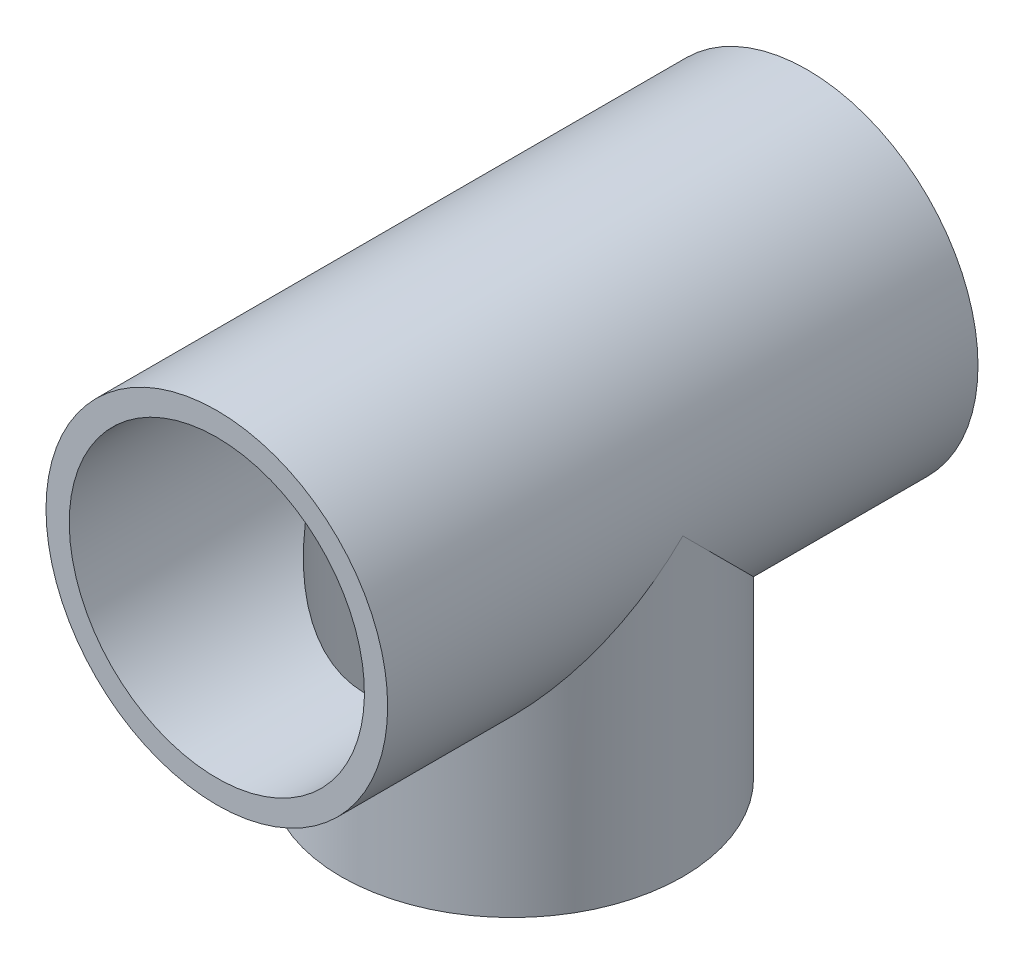
ISO-10303-21;
HEADER;
FILE_DESCRIPTION(('STEP AP214'),'2;1');
FILE_NAME('part.step','',(''),(''),'','','');
FILE_SCHEMA(('AUTOMOTIVE_DESIGN { 1 0 10303 214 1 1 1 1 }'));
ENDSEC;
DATA;
#1=APPLICATION_CONTEXT('core data for automotive mechanical design processes');
#2=APPLICATION_PROTOCOL_DEFINITION('international standard','automotive_design',2000,#1);
#3=PRODUCT_CONTEXT('',#1,'mechanical');
#4=PRODUCT('Part','Part','',(#3));
#5=PRODUCT_RELATED_PRODUCT_CATEGORY('part','',(#4));
#6=PRODUCT_DEFINITION_FORMATION('','',#4);
#7=PRODUCT_DEFINITION_CONTEXT('part definition',#1,'design');
#8=PRODUCT_DEFINITION('design','',#6,#7);
#9=PRODUCT_DEFINITION_SHAPE('','',#8);
#10=(LENGTH_UNIT() NAMED_UNIT(*) SI_UNIT(.MILLI.,.METRE.));
#11=(NAMED_UNIT(*) PLANE_ANGLE_UNIT() SI_UNIT($,.RADIAN.));
#12=(NAMED_UNIT(*) SI_UNIT($,.STERADIAN.) SOLID_ANGLE_UNIT());
#13=UNCERTAINTY_MEASURE_WITH_UNIT(LENGTH_MEASURE(1.E-05),#10,'distance_accuracy_value','');
#14=(GEOMETRIC_REPRESENTATION_CONTEXT(3) GLOBAL_UNCERTAINTY_ASSIGNED_CONTEXT((#13)) GLOBAL_UNIT_ASSIGNED_CONTEXT((#10,
#11,#12)) REPRESENTATION_CONTEXT('',''));
#15=CARTESIAN_POINT('',(0.,0.,0.));
#16=DIRECTION('',(0.,0.,1.));
#17=DIRECTION('',(1.,0.,0.));
#18=AXIS2_PLACEMENT_3D('',#15,#16,#17);
#19=CARTESIAN_POINT('',(0.,0.,12.7));
#20=DIRECTION('',(0.,0.,-1.));
#21=DIRECTION('',(0.,1.,0.));
#22=AXIS2_PLACEMENT_3D('',#19,#20,#21);
#23=CYLINDRICAL_SURFACE('',#22,6.35);
#24=CARTESIAN_POINT('',(0.,0.,12.7));
#25=DIRECTION('',(0.,0.,-1.));
#26=DIRECTION('',(0.,1.,0.));
#27=AXIS2_PLACEMENT_3D('',#24,#25,#26);
#28=CIRCLE('',#27,6.35);
#29=CARTESIAN_POINT('',(0.,6.35,12.7));
#30=VERTEX_POINT('',#29);
#31=EDGE_CURVE('E90',#30,#30,#28,.T.);
#32=ORIENTED_EDGE('',*,*,#31,.F.);
#33=EDGE_LOOP('',(#32));
#34=FACE_BOUND('',#33,.T.);
#35=CARTESIAN_POINT('',(0.,0.,-12.7));
#36=DIRECTION('',(0.,0.,-1.));
#37=DIRECTION('',(0.,1.,0.));
#38=AXIS2_PLACEMENT_3D('',#35,#36,#37);
#39=CIRCLE('',#38,6.35);
#40=CARTESIAN_POINT('',(0.,6.35,-12.7));
#41=VERTEX_POINT('',#40);
#42=EDGE_CURVE('E96',#41,#41,#39,.T.);
#43=ORIENTED_EDGE('',*,*,#42,.T.);
#44=EDGE_LOOP('',(#43));
#45=FACE_BOUND('',#44,.T.);
#46=CARTESIAN_POINT('',(0.,0.,0.));
#47=DIRECTION('',(0.,-0.707106781186547,-0.707106781186548));
#48=DIRECTION('',(0.,-0.707106781186548,0.707106781186547));
#49=AXIS2_PLACEMENT_3D('',#46,#47,#48);
#50=ELLIPSE('',#49,8.98025612106915,6.35);
#51=CARTESIAN_POINT('',(6.35,0.,0.));
#52=VERTEX_POINT('',#51);
#53=CARTESIAN_POINT('',(-6.35,0.,0.));
#54=VERTEX_POINT('',#53);
#55=EDGE_CURVE('E62',#52,#54,#50,.T.);
#56=ORIENTED_EDGE('',*,*,#55,.T.);
#57=CARTESIAN_POINT('',(0.,0.,0.));
#58=DIRECTION('',(0.,-0.707106781186548,0.707106781186547));
#59=DIRECTION('',(0.,-0.707106781186547,-0.707106781186548));
#60=AXIS2_PLACEMENT_3D('',#57,#58,#59);
#61=ELLIPSE('',#60,8.98025612106915,6.35);
#62=EDGE_CURVE('E74',#54,#52,#61,.T.);
#63=ORIENTED_EDGE('',*,*,#62,.T.);
#64=EDGE_LOOP('',(#56,#63));
#65=FACE_BOUND('',#64,.T.);
#66=ADVANCED_FACE('F48',(#34,#45,#65),#23,.F.);
#67=CARTESIAN_POINT('',(0.,0.,12.7));
#68=DIRECTION('',(0.,0.,-1.));
#69=DIRECTION('',(0.,1.,0.));
#70=AXIS2_PLACEMENT_3D('',#67,#68,#69);
#71=CYLINDRICAL_SURFACE('',#70,7.35);
#72=CARTESIAN_POINT('',(0.,0.,-12.7));
#73=DIRECTION('',(0.,0.,-1.));
#74=DIRECTION('',(0.,1.,0.));
#75=AXIS2_PLACEMENT_3D('',#72,#73,#74);
#76=CIRCLE('',#75,7.35);
#77=CARTESIAN_POINT('',(0.,7.35,-12.7));
#78=VERTEX_POINT('',#77);
#79=EDGE_CURVE('E12',#78,#78,#76,.T.);
#80=ORIENTED_EDGE('',*,*,#79,.F.);
#81=EDGE_LOOP('',(#80));
#82=FACE_BOUND('',#81,.T.);
#83=CARTESIAN_POINT('',(0.,0.,12.7));
#84=DIRECTION('',(0.,0.,-1.));
#85=DIRECTION('',(0.,1.,0.));
#86=AXIS2_PLACEMENT_3D('',#83,#84,#85);
#87=CIRCLE('',#86,7.35);
#88=CARTESIAN_POINT('',(0.,7.35,12.7));
#89=VERTEX_POINT('',#88);
#90=EDGE_CURVE('E52',#89,#89,#87,.T.);
#91=ORIENTED_EDGE('',*,*,#90,.T.);
#92=EDGE_LOOP('',(#91));
#93=FACE_BOUND('',#92,.T.);
#94=CARTESIAN_POINT('',(0.,0.,0.));
#95=DIRECTION('',(0.,-0.707106781186548,0.707106781186547));
#96=DIRECTION('',(0.,-0.707106781186547,-0.707106781186548));
#97=AXIS2_PLACEMENT_3D('',#94,#95,#96);
#98=ELLIPSE('',#97,10.3944696834422,7.35);
#99=CARTESIAN_POINT('',(-7.35,0.,0.));
#100=VERTEX_POINT('',#99);
#101=CARTESIAN_POINT('',(7.35,0.,0.));
#102=VERTEX_POINT('',#101);
#103=EDGE_CURVE('E88',#100,#102,#98,.T.);
#104=ORIENTED_EDGE('',*,*,#103,.F.);
#105=CARTESIAN_POINT('',(0.,0.,0.));
#106=DIRECTION('',(0.,-0.707106781186547,-0.707106781186548));
#107=DIRECTION('',(0.,-0.707106781186548,0.707106781186547));
#108=AXIS2_PLACEMENT_3D('',#105,#106,#107);
#109=ELLIPSE('',#108,10.3944696834422,7.35);
#110=EDGE_CURVE('E69',#102,#100,#109,.T.);
#111=ORIENTED_EDGE('',*,*,#110,.F.);
#112=EDGE_LOOP('',(#104,#111));
#113=FACE_BOUND('',#112,.T.);
#114=ADVANCED_FACE('F50',(#82,#93,#113),#71,.T.);
#115=CARTESIAN_POINT('',(0.,0.,12.7));
#116=DIRECTION('',(0.,0.,-1.));
#117=DIRECTION('',(0.,1.,0.));
#118=AXIS2_PLACEMENT_3D('',#115,#116,#117);
#119=PLANE('',#118);
#120=ORIENTED_EDGE('',*,*,#31,.T.);
#121=EDGE_LOOP('',(#120));
#122=FACE_BOUND('',#121,.T.);
#123=ORIENTED_EDGE('',*,*,#90,.F.);
#124=EDGE_LOOP('',(#123));
#125=FACE_BOUND('',#124,.T.);
#126=ADVANCED_FACE('F105',(#122,#125),#119,.F.);
#127=CARTESIAN_POINT('',(0.,0.,-12.7));
#128=DIRECTION('',(0.,0.,-1.));
#129=DIRECTION('',(0.,1.,0.));
#130=AXIS2_PLACEMENT_3D('',#127,#128,#129);
#131=PLANE('',#130);
#132=ORIENTED_EDGE('',*,*,#42,.F.);
#133=EDGE_LOOP('',(#132));
#134=FACE_BOUND('',#133,.T.);
#135=ORIENTED_EDGE('',*,*,#79,.T.);
#136=EDGE_LOOP('',(#135));
#137=FACE_BOUND('',#136,.T.);
#138=ADVANCED_FACE('F107',(#134,#137),#131,.T.);
#139=CARTESIAN_POINT('',(0.,7.351,0.));
#140=DIRECTION('',(0.,-1.,0.));
#141=DIRECTION('',(0.,0.,-1.));
#142=AXIS2_PLACEMENT_3D('',#139,#140,#141);
#143=CYLINDRICAL_SURFACE('',#142,7.35);
#144=ORIENTED_EDGE('',*,*,#103,.T.);
#145=ORIENTED_EDGE('',*,*,#110,.T.);
#146=EDGE_LOOP('',(#144,#145));
#147=FACE_BOUND('',#146,.T.);
#148=CARTESIAN_POINT('',(0.,-12.7,0.));
#149=DIRECTION('',(0.,1.,0.));
#150=DIRECTION('',(1.,0.,0.));
#151=AXIS2_PLACEMENT_3D('',#148,#149,#150);
#152=CIRCLE('',#151,7.35);
#153=CARTESIAN_POINT('',(7.35,-12.7,0.));
#154=VERTEX_POINT('',#153);
#155=EDGE_CURVE('E81',#154,#154,#152,.T.);
#156=ORIENTED_EDGE('',*,*,#155,.T.);
#157=EDGE_LOOP('',(#156));
#158=FACE_BOUND('',#157,.T.);
#159=ADVANCED_FACE('F109',(#147,#158),#143,.T.);
#160=CARTESIAN_POINT('',(0.,-12.7,0.));
#161=DIRECTION('',(0.,1.,0.));
#162=DIRECTION('',(0.,0.,1.));
#163=AXIS2_PLACEMENT_3D('',#160,#161,#162);
#164=PLANE('',#163);
#165=ORIENTED_EDGE('',*,*,#155,.F.);
#166=EDGE_LOOP('',(#165));
#167=FACE_BOUND('',#166,.T.);
#168=CARTESIAN_POINT('',(0.,-12.7,0.));
#169=DIRECTION('',(0.,1.,0.));
#170=DIRECTION('',(0.,0.,1.));
#171=AXIS2_PLACEMENT_3D('',#168,#169,#170);
#172=CIRCLE('',#171,6.35);
#173=CARTESIAN_POINT('',(0.,-12.7,6.35));
#174=VERTEX_POINT('',#173);
#175=EDGE_CURVE('E78',#174,#174,#172,.T.);
#176=ORIENTED_EDGE('',*,*,#175,.T.);
#177=EDGE_LOOP('',(#176));
#178=FACE_BOUND('',#177,.T.);
#179=ADVANCED_FACE('F118',(#167,#178),#164,.F.);
#180=CARTESIAN_POINT('',(0.,7.351,0.));
#181=DIRECTION('',(0.,-1.,0.));
#182=DIRECTION('',(0.,0.,-1.));
#183=AXIS2_PLACEMENT_3D('',#180,#181,#182);
#184=CYLINDRICAL_SURFACE('',#183,6.35);
#185=ORIENTED_EDGE('',*,*,#175,.F.);
#186=EDGE_LOOP('',(#185));
#187=FACE_BOUND('',#186,.T.);
#188=ORIENTED_EDGE('',*,*,#62,.F.);
#189=ORIENTED_EDGE('',*,*,#55,.F.);
#190=EDGE_LOOP('',(#188,#189));
#191=FACE_BOUND('',#190,.T.);
#192=ADVANCED_FACE('F75',(#187,#191),#184,.F.);
#193=CLOSED_SHELL('',(#66,#114,#126,#138,#159,#179,#192));
#194=MANIFOLD_SOLID_BREP('B2',#193);
#195=ADVANCED_BREP_SHAPE_REPRESENTATION('',(#18,#194),#14);
#196=SHAPE_DEFINITION_REPRESENTATION(#9,#195);
ENDSEC;
END-ISO-10303-21;
